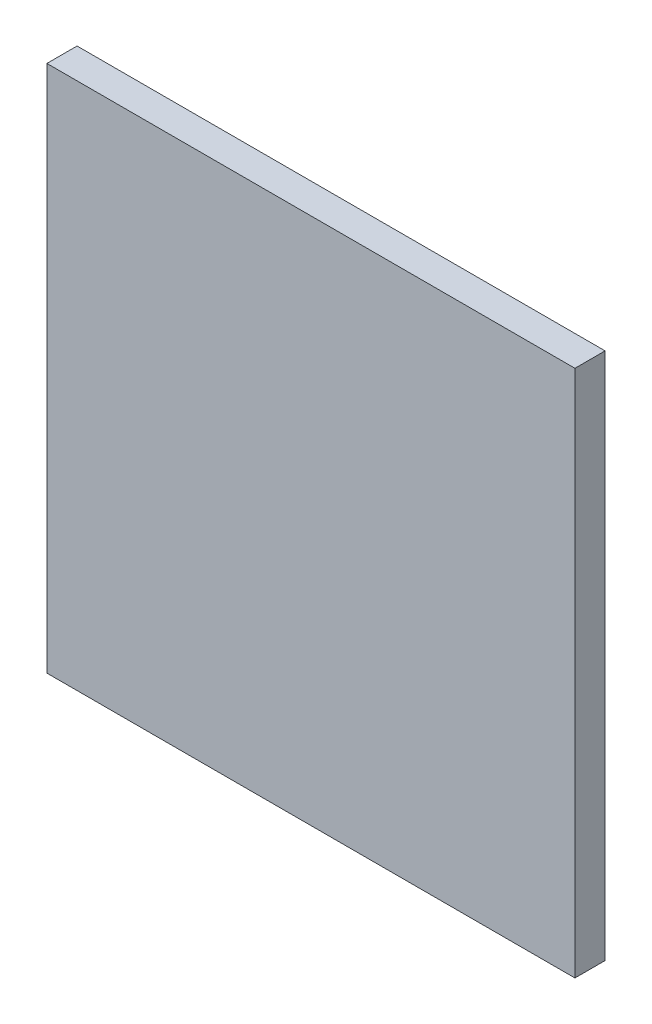
ISO-10303-21;
HEADER;
FILE_DESCRIPTION(('STEP AP214'),'2;1');
FILE_NAME('part.step','',(''),(''),'','','');
FILE_SCHEMA(('AUTOMOTIVE_DESIGN { 1 0 10303 214 1 1 1 1 }'));
ENDSEC;
DATA;
#1=APPLICATION_CONTEXT('core data for automotive mechanical design processes');
#2=APPLICATION_PROTOCOL_DEFINITION('international standard','automotive_design',2000,#1);
#3=PRODUCT_CONTEXT('',#1,'mechanical');
#4=PRODUCT('Part','Part','',(#3));
#5=PRODUCT_RELATED_PRODUCT_CATEGORY('part','',(#4));
#6=PRODUCT_DEFINITION_FORMATION('','',#4);
#7=PRODUCT_DEFINITION_CONTEXT('part definition',#1,'design');
#8=PRODUCT_DEFINITION('design','',#6,#7);
#9=PRODUCT_DEFINITION_SHAPE('','',#8);
#10=(LENGTH_UNIT() NAMED_UNIT(*) SI_UNIT(.MILLI.,.METRE.));
#11=(NAMED_UNIT(*) PLANE_ANGLE_UNIT() SI_UNIT($,.RADIAN.));
#12=(NAMED_UNIT(*) SI_UNIT($,.STERADIAN.) SOLID_ANGLE_UNIT());
#13=UNCERTAINTY_MEASURE_WITH_UNIT(LENGTH_MEASURE(1.E-05),#10,'distance_accuracy_value','');
#14=(GEOMETRIC_REPRESENTATION_CONTEXT(3) GLOBAL_UNCERTAINTY_ASSIGNED_CONTEXT((#13)) GLOBAL_UNIT_ASSIGNED_CONTEXT((#10,
#11,#12)) REPRESENTATION_CONTEXT('',''));
#15=CARTESIAN_POINT('',(0.,0.,0.));
#16=DIRECTION('',(0.,0.,1.));
#17=DIRECTION('',(1.,0.,0.));
#18=AXIS2_PLACEMENT_3D('',#15,#16,#17);
#19=CARTESIAN_POINT('',(0.,0.,20.));
#20=DIRECTION('',(1.,0.,0.));
#21=DIRECTION('',(0.,0.,-1.));
#22=AXIS2_PLACEMENT_3D('',#19,#20,#21);
#23=PLANE('',#22);
#24=DIRECTION('',(0.,-1.,0.));
#25=VECTOR('',#24,1.);
#26=CARTESIAN_POINT('',(0.,0.,0.));
#27=LINE('',#26,#25);
#28=CARTESIAN_POINT('',(0.,350.,0.));
#29=VERTEX_POINT('',#28);
#30=CARTESIAN_POINT('',(0.,0.,0.));
#31=VERTEX_POINT('',#30);
#32=EDGE_CURVE('E102',#29,#31,#27,.T.);
#33=ORIENTED_EDGE('',*,*,#32,.T.);
#34=DIRECTION('',(0.,0.,-1.));
#35=VECTOR('',#34,1.);
#36=CARTESIAN_POINT('',(0.,0.,20.));
#37=LINE('',#36,#35);
#38=CARTESIAN_POINT('',(0.,0.,20.));
#39=VERTEX_POINT('',#38);
#40=EDGE_CURVE('E11',#39,#31,#37,.T.);
#41=ORIENTED_EDGE('',*,*,#40,.F.);
#42=DIRECTION('',(0.,-1.,0.));
#43=VECTOR('',#42,1.);
#44=CARTESIAN_POINT('',(0.,0.,20.));
#45=LINE('',#44,#43);
#46=CARTESIAN_POINT('',(0.,350.,20.));
#47=VERTEX_POINT('',#46);
#48=EDGE_CURVE('E90',#47,#39,#45,.T.);
#49=ORIENTED_EDGE('',*,*,#48,.F.);
#50=DIRECTION('',(0.,0.,-1.));
#51=VECTOR('',#50,1.);
#52=CARTESIAN_POINT('',(0.,350.,20.));
#53=LINE('',#52,#51);
#54=EDGE_CURVE('E98',#47,#29,#53,.T.);
#55=ORIENTED_EDGE('',*,*,#54,.T.);
#56=EDGE_LOOP('',(#33,#41,#49,#55));
#57=FACE_BOUND('',#56,.T.);
#58=ADVANCED_FACE('F39',(#57),#23,.F.);
#59=CARTESIAN_POINT('',(0.,0.,20.));
#60=DIRECTION('',(0.,1.,0.));
#61=DIRECTION('',(0.,0.,1.));
#62=AXIS2_PLACEMENT_3D('',#59,#60,#61);
#63=PLANE('',#62);
#64=DIRECTION('',(1.,0.,0.));
#65=VECTOR('',#64,1.);
#66=CARTESIAN_POINT('',(0.,0.,0.));
#67=LINE('',#66,#65);
#68=CARTESIAN_POINT('',(350.,0.,0.));
#69=VERTEX_POINT('',#68);
#70=EDGE_CURVE('E94',#31,#69,#67,.T.);
#71=ORIENTED_EDGE('',*,*,#70,.T.);
#72=DIRECTION('',(0.,0.,-1.));
#73=VECTOR('',#72,1.);
#74=CARTESIAN_POINT('',(350.,0.,20.));
#75=LINE('',#74,#73);
#76=CARTESIAN_POINT('',(350.,0.,20.));
#77=VERTEX_POINT('',#76);
#78=EDGE_CURVE('E47',#77,#69,#75,.T.);
#79=ORIENTED_EDGE('',*,*,#78,.F.);
#80=DIRECTION('',(1.,0.,0.));
#81=VECTOR('',#80,1.);
#82=CARTESIAN_POINT('',(0.,0.,20.));
#83=LINE('',#82,#81);
#84=EDGE_CURVE('E85',#39,#77,#83,.T.);
#85=ORIENTED_EDGE('',*,*,#84,.F.);
#86=ORIENTED_EDGE('',*,*,#40,.T.);
#87=EDGE_LOOP('',(#71,#79,#85,#86));
#88=FACE_BOUND('',#87,.T.);
#89=ADVANCED_FACE('F93',(#88),#63,.F.);
#90=CARTESIAN_POINT('',(350.,0.,20.));
#91=DIRECTION('',(-1.,0.,0.));
#92=DIRECTION('',(0.,0.,1.));
#93=AXIS2_PLACEMENT_3D('',#90,#91,#92);
#94=PLANE('',#93);
#95=DIRECTION('',(0.,1.,0.));
#96=VECTOR('',#95,1.);
#97=CARTESIAN_POINT('',(350.,0.,0.));
#98=LINE('',#97,#96);
#99=CARTESIAN_POINT('',(350.,350.,0.));
#100=VERTEX_POINT('',#99);
#101=EDGE_CURVE('E72',#69,#100,#98,.T.);
#102=ORIENTED_EDGE('',*,*,#101,.T.);
#103=DIRECTION('',(0.,0.,-1.));
#104=VECTOR('',#103,1.);
#105=CARTESIAN_POINT('',(350.,350.,20.));
#106=LINE('',#105,#104);
#107=CARTESIAN_POINT('',(350.,350.,20.));
#108=VERTEX_POINT('',#107);
#109=EDGE_CURVE('E95',#108,#100,#106,.T.);
#110=ORIENTED_EDGE('',*,*,#109,.F.);
#111=DIRECTION('',(0.,1.,0.));
#112=VECTOR('',#111,1.);
#113=CARTESIAN_POINT('',(350.,0.,20.));
#114=LINE('',#113,#112);
#115=EDGE_CURVE('E88',#77,#108,#114,.T.);
#116=ORIENTED_EDGE('',*,*,#115,.F.);
#117=ORIENTED_EDGE('',*,*,#78,.T.);
#118=EDGE_LOOP('',(#102,#110,#116,#117));
#119=FACE_BOUND('',#118,.T.);
#120=ADVANCED_FACE('F96',(#119),#94,.F.);
#121=CARTESIAN_POINT('',(0.,350.,20.));
#122=DIRECTION('',(0.,-1.,0.));
#123=DIRECTION('',(0.,0.,-1.));
#124=AXIS2_PLACEMENT_3D('',#121,#122,#123);
#125=PLANE('',#124);
#126=DIRECTION('',(-1.,0.,0.));
#127=VECTOR('',#126,1.);
#128=CARTESIAN_POINT('',(0.,350.,0.));
#129=LINE('',#128,#127);
#130=EDGE_CURVE('E78',#100,#29,#129,.T.);
#131=ORIENTED_EDGE('',*,*,#130,.T.);
#132=ORIENTED_EDGE('',*,*,#54,.F.);
#133=DIRECTION('',(-1.,0.,0.));
#134=VECTOR('',#133,1.);
#135=CARTESIAN_POINT('',(0.,350.,20.));
#136=LINE('',#135,#134);
#137=EDGE_CURVE('E55',#108,#47,#136,.T.);
#138=ORIENTED_EDGE('',*,*,#137,.F.);
#139=ORIENTED_EDGE('',*,*,#109,.T.);
#140=EDGE_LOOP('',(#131,#132,#138,#139));
#141=FACE_BOUND('',#140,.T.);
#142=ADVANCED_FACE('F109',(#141),#125,.F.);
#143=CARTESIAN_POINT('',(0.,0.,20.));
#144=DIRECTION('',(0.,0.,-1.));
#145=DIRECTION('',(-1.,0.,0.));
#146=AXIS2_PLACEMENT_3D('',#143,#144,#145);
#147=PLANE('',#146);
#148=ORIENTED_EDGE('',*,*,#48,.T.);
#149=ORIENTED_EDGE('',*,*,#84,.T.);
#150=ORIENTED_EDGE('',*,*,#115,.T.);
#151=ORIENTED_EDGE('',*,*,#137,.T.);
#152=EDGE_LOOP('',(#148,#149,#150,#151));
#153=FACE_BOUND('',#152,.T.);
#154=ADVANCED_FACE('F86',(#153),#147,.F.);
#155=CARTESIAN_POINT('',(0.,0.,0.));
#156=DIRECTION('',(0.,0.,-1.));
#157=DIRECTION('',(-1.,0.,0.));
#158=AXIS2_PLACEMENT_3D('',#155,#156,#157);
#159=PLANE('',#158);
#160=ORIENTED_EDGE('',*,*,#32,.F.);
#161=ORIENTED_EDGE('',*,*,#130,.F.);
#162=ORIENTED_EDGE('',*,*,#101,.F.);
#163=ORIENTED_EDGE('',*,*,#70,.F.);
#164=EDGE_LOOP('',(#160,#161,#162,#163));
#165=FACE_BOUND('',#164,.T.);
#166=ADVANCED_FACE('F112',(#165),#159,.T.);
#167=CLOSED_SHELL('',(#58,#89,#120,#142,#154,#166));
#168=MANIFOLD_SOLID_BREP('B2',#167);
#169=ADVANCED_BREP_SHAPE_REPRESENTATION('',(#18,#168),#14);
#170=SHAPE_DEFINITION_REPRESENTATION(#9,#169);
ENDSEC;
END-ISO-10303-21;
